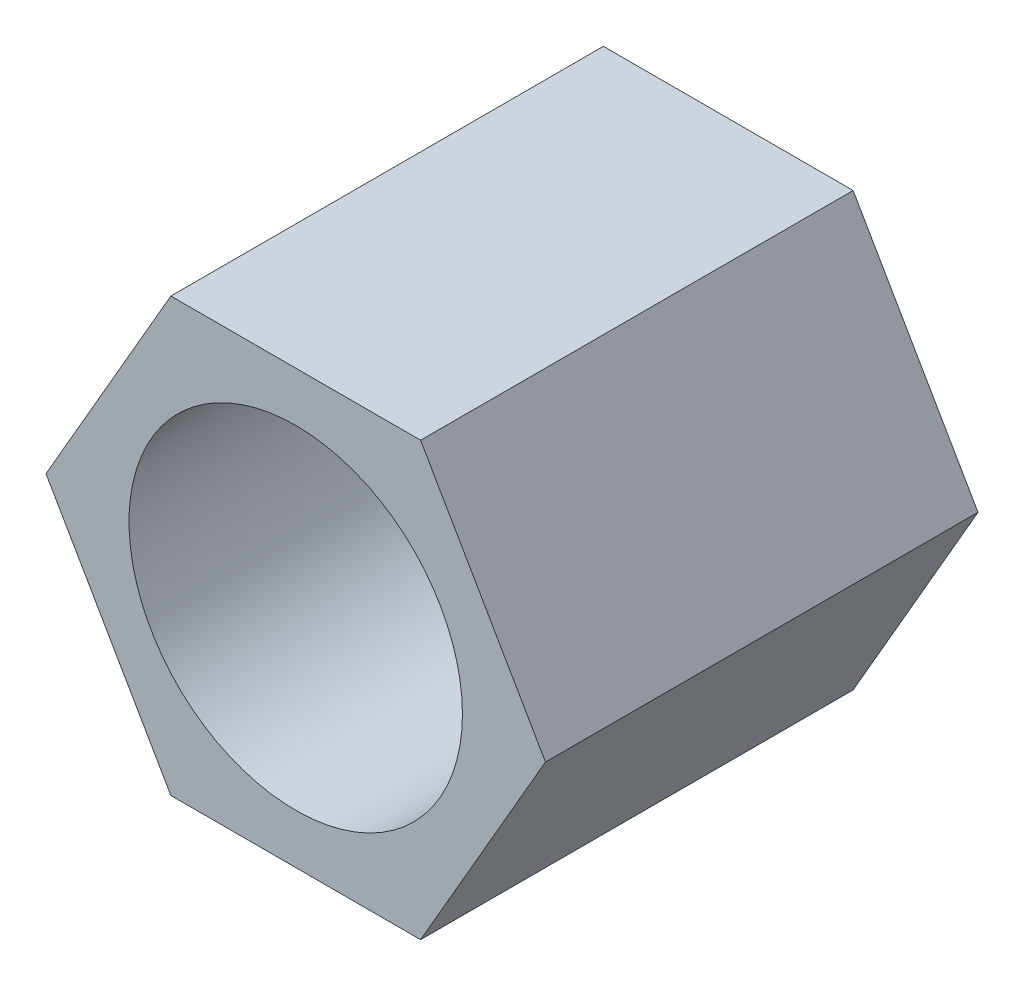
ISO-10303-21;
HEADER;
FILE_DESCRIPTION(('STEP AP214'),'2;1');
FILE_NAME('part.step','',(''),(''),'','','');
FILE_SCHEMA(('AUTOMOTIVE_DESIGN { 1 0 10303 214 1 1 1 1 }'));
ENDSEC;
DATA;
#1=APPLICATION_CONTEXT('core data for automotive mechanical design processes');
#2=APPLICATION_PROTOCOL_DEFINITION('international standard','automotive_design',2000,#1);
#3=PRODUCT_CONTEXT('',#1,'mechanical');
#4=PRODUCT('Part','Part','',(#3));
#5=PRODUCT_RELATED_PRODUCT_CATEGORY('part','',(#4));
#6=PRODUCT_DEFINITION_FORMATION('','',#4);
#7=PRODUCT_DEFINITION_CONTEXT('part definition',#1,'design');
#8=PRODUCT_DEFINITION('design','',#6,#7);
#9=PRODUCT_DEFINITION_SHAPE('','',#8);
#10=(LENGTH_UNIT() NAMED_UNIT(*) SI_UNIT(.MILLI.,.METRE.));
#11=(NAMED_UNIT(*) PLANE_ANGLE_UNIT() SI_UNIT($,.RADIAN.));
#12=(NAMED_UNIT(*) SI_UNIT($,.STERADIAN.) SOLID_ANGLE_UNIT());
#13=UNCERTAINTY_MEASURE_WITH_UNIT(LENGTH_MEASURE(1.E-05),#10,'distance_accuracy_value','');
#14=(GEOMETRIC_REPRESENTATION_CONTEXT(3) GLOBAL_UNCERTAINTY_ASSIGNED_CONTEXT((#13)) GLOBAL_UNIT_ASSIGNED_CONTEXT((#10,
#11,#12)) REPRESENTATION_CONTEXT('',''));
#15=CARTESIAN_POINT('',(0.,0.,0.));
#16=DIRECTION('',(0.,0.,1.));
#17=DIRECTION('',(1.,0.,0.));
#18=AXIS2_PLACEMENT_3D('',#15,#16,#17);
#19=CARTESIAN_POINT('',(0.,0.,-9.525));
#20=DIRECTION('',(0.,0.,1.));
#21=DIRECTION('',(1.,0.,0.));
#22=AXIS2_PLACEMENT_3D('',#19,#20,#21);
#23=PLANE('',#22);
#24=DIRECTION('',(-1.,0.,0.));
#25=VECTOR('',#24,1.);
#26=CARTESIAN_POINT('',(-5.49926131403109,-9.52500000000004,-9.525));
#27=LINE('',#26,#25);
#28=CARTESIAN_POINT('',(5.49926131403127,-9.52499999999995,-9.525));
#29=VERTEX_POINT('',#28);
#30=CARTESIAN_POINT('',(-5.49926131403109,-9.52500000000004,-9.525));
#31=VERTEX_POINT('',#30);
#32=EDGE_CURVE('E113',#29,#31,#27,.T.);
#33=ORIENTED_EDGE('',*,*,#32,.T.);
#34=DIRECTION('',(-0.500000000000007,0.866025403784435,0.));
#35=VECTOR('',#34,1.);
#36=CARTESIAN_POINT('',(-10.9985226280624,0.,-9.525));
#37=LINE('',#36,#35);
#38=CARTESIAN_POINT('',(-10.9985226280624,0.,-9.525));
#39=VERTEX_POINT('',#38);
#40=EDGE_CURVE('E118',#31,#39,#37,.T.);
#41=ORIENTED_EDGE('',*,*,#40,.T.);
#42=DIRECTION('',(0.499999999999995,0.866025403784442,0.));
#43=VECTOR('',#42,1.);
#44=CARTESIAN_POINT('',(-5.49926131403122,9.52499999999996,-9.525));
#45=LINE('',#44,#43);
#46=CARTESIAN_POINT('',(-5.49926131403122,9.52499999999997,-9.525));
#47=VERTEX_POINT('',#46);
#48=EDGE_CURVE('E124',#39,#47,#45,.T.);
#49=ORIENTED_EDGE('',*,*,#48,.T.);
#50=DIRECTION('',(1.,0.,0.));
#51=VECTOR('',#50,1.);
#52=CARTESIAN_POINT('',(5.49926131403116,9.525,-9.525));
#53=LINE('',#52,#51);
#54=CARTESIAN_POINT('',(5.49926131403116,9.525,-9.525));
#55=VERTEX_POINT('',#54);
#56=EDGE_CURVE('E90',#47,#55,#53,.T.);
#57=ORIENTED_EDGE('',*,*,#56,.T.);
#58=DIRECTION('',(0.500000000000001,-0.866025403784438,0.));
#59=VECTOR('',#58,1.);
#60=CARTESIAN_POINT('',(10.9985226280624,0.,-9.525));
#61=LINE('',#60,#59);
#62=CARTESIAN_POINT('',(10.9985226280624,0.,-9.525));
#63=VERTEX_POINT('',#62);
#64=EDGE_CURVE('E68',#55,#63,#61,.T.);
#65=ORIENTED_EDGE('',*,*,#64,.T.);
#66=DIRECTION('',(-0.499999999999995,-0.866025403784442,0.));
#67=VECTOR('',#66,1.);
#68=CARTESIAN_POINT('',(5.49926131403129,-9.52499999999992,-9.525));
#69=LINE('',#68,#67);
#70=EDGE_CURVE('E74',#63,#29,#69,.T.);
#71=ORIENTED_EDGE('',*,*,#70,.T.);
#72=EDGE_LOOP('',(#33,#41,#49,#57,#65,#71));
#73=FACE_BOUND('',#72,.T.);
#74=CARTESIAN_POINT('',(0.,0.,-9.525));
#75=DIRECTION('',(0.,0.,-1.));
#76=DIRECTION('',(-1.,0.,0.));
#77=AXIS2_PLACEMENT_3D('',#74,#75,#76);
#78=CIRCLE('',#77,3.429);
#79=CARTESIAN_POINT('',(-3.429,0.,-9.525));
#80=VERTEX_POINT('',#79);
#81=EDGE_CURVE('E20',#80,#80,#78,.F.);
#82=ORIENTED_EDGE('',*,*,#81,.T.);
#83=EDGE_LOOP('',(#82));
#84=FACE_BOUND('',#83,.T.);
#85=ADVANCED_FACE('F17',(#73,#84),#23,.F.);
#86=CARTESIAN_POINT('',(5.49926131403129,-9.52499999999992,9.525));
#87=DIRECTION('',(-0.866025403784442,0.499999999999995,0.));
#88=DIRECTION('',(-0.499999999999995,-0.866025403784442,0.));
#89=AXIS2_PLACEMENT_3D('',#86,#87,#88);
#90=PLANE('',#89);
#91=DIRECTION('',(0.,0.,1.));
#92=VECTOR('',#91,1.);
#93=CARTESIAN_POINT('',(10.9985226280624,0.,9.525));
#94=LINE('',#93,#92);
#95=CARTESIAN_POINT('',(10.9985226280624,0.,9.525));
#96=VERTEX_POINT('',#95);
#97=EDGE_CURVE('E77',#63,#96,#94,.T.);
#98=ORIENTED_EDGE('',*,*,#97,.T.);
#99=DIRECTION('',(0.499999999999995,0.866025403784441,0.));
#100=VECTOR('',#99,1.);
#101=CARTESIAN_POINT('',(5.49926131403129,-9.52499999999992,9.525));
#102=LINE('',#101,#100);
#103=CARTESIAN_POINT('',(5.49926131403127,-9.52499999999995,9.525));
#104=VERTEX_POINT('',#103);
#105=EDGE_CURVE('E111',#104,#96,#102,.T.);
#106=ORIENTED_EDGE('',*,*,#105,.F.);
#107=DIRECTION('',(0.,0.,1.));
#108=VECTOR('',#107,1.);
#109=CARTESIAN_POINT('',(5.49926131403129,-9.52499999999992,9.525));
#110=LINE('',#109,#108);
#111=EDGE_CURVE('E79',#104,#29,#110,.F.);
#112=ORIENTED_EDGE('',*,*,#111,.T.);
#113=ORIENTED_EDGE('',*,*,#70,.F.);
#114=EDGE_LOOP('',(#98,#106,#112,#113));
#115=FACE_BOUND('',#114,.T.);
#116=ADVANCED_FACE('F75',(#115),#90,.F.);
#117=CARTESIAN_POINT('',(10.9985226280624,0.,9.525));
#118=DIRECTION('',(-0.866025403784438,-0.500000000000001,0.));
#119=DIRECTION('',(0.500000000000001,-0.866025403784438,0.));
#120=AXIS2_PLACEMENT_3D('',#117,#118,#119);
#121=PLANE('',#120);
#122=DIRECTION('',(0.,0.,1.));
#123=VECTOR('',#122,1.);
#124=CARTESIAN_POINT('',(5.49926131403116,9.525,9.525));
#125=LINE('',#124,#123);
#126=CARTESIAN_POINT('',(5.49926131403116,9.525,9.525));
#127=VERTEX_POINT('',#126);
#128=EDGE_CURVE('E91',#55,#127,#125,.T.);
#129=ORIENTED_EDGE('',*,*,#128,.T.);
#130=DIRECTION('',(-0.500000000000001,0.866025403784438,0.));
#131=VECTOR('',#130,1.);
#132=CARTESIAN_POINT('',(10.9985226280624,0.,9.525));
#133=LINE('',#132,#131);
#134=EDGE_CURVE('E85',#96,#127,#133,.T.);
#135=ORIENTED_EDGE('',*,*,#134,.F.);
#136=ORIENTED_EDGE('',*,*,#97,.F.);
#137=ORIENTED_EDGE('',*,*,#64,.F.);
#138=EDGE_LOOP('',(#129,#135,#136,#137));
#139=FACE_BOUND('',#138,.T.);
#140=ADVANCED_FACE('F84',(#139),#121,.F.);
#141=CARTESIAN_POINT('',(5.49926131403116,9.525,9.525));
#142=DIRECTION('',(0.,-1.,0.));
#143=DIRECTION('',(1.,0.,0.));
#144=AXIS2_PLACEMENT_3D('',#141,#142,#143);
#145=PLANE('',#144);
#146=DIRECTION('',(0.,0.,1.));
#147=VECTOR('',#146,1.);
#148=CARTESIAN_POINT('',(-5.49926131403122,9.52499999999996,9.525));
#149=LINE('',#148,#147);
#150=CARTESIAN_POINT('',(-5.49926131403122,9.52499999999997,9.525));
#151=VERTEX_POINT('',#150);
#152=EDGE_CURVE('E126',#47,#151,#149,.T.);
#153=ORIENTED_EDGE('',*,*,#152,.T.);
#154=DIRECTION('',(1.,0.,0.));
#155=VECTOR('',#154,1.);
#156=CARTESIAN_POINT('',(0.,9.525,9.525));
#157=LINE('',#156,#155);
#158=EDGE_CURVE('E108',#127,#151,#157,.F.);
#159=ORIENTED_EDGE('',*,*,#158,.F.);
#160=ORIENTED_EDGE('',*,*,#128,.F.);
#161=ORIENTED_EDGE('',*,*,#56,.F.);
#162=EDGE_LOOP('',(#153,#159,#160,#161));
#163=FACE_BOUND('',#162,.T.);
#164=ADVANCED_FACE('F132',(#163),#145,.F.);
#165=CARTESIAN_POINT('',(-5.49926131403122,9.52499999999996,9.525));
#166=DIRECTION('',(0.866025403784442,-0.499999999999995,0.));
#167=DIRECTION('',(0.499999999999995,0.866025403784442,0.));
#168=AXIS2_PLACEMENT_3D('',#165,#166,#167);
#169=PLANE('',#168);
#170=DIRECTION('',(0.,0.,1.));
#171=VECTOR('',#170,1.);
#172=CARTESIAN_POINT('',(-10.9985226280624,0.,9.525));
#173=LINE('',#172,#171);
#174=CARTESIAN_POINT('',(-10.9985226280624,0.,9.525));
#175=VERTEX_POINT('',#174);
#176=EDGE_CURVE('E121',#39,#175,#173,.T.);
#177=ORIENTED_EDGE('',*,*,#176,.T.);
#178=DIRECTION('',(-0.499999999999995,-0.866025403784442,0.));
#179=VECTOR('',#178,1.);
#180=CARTESIAN_POINT('',(-5.49926131403122,9.52499999999996,9.525));
#181=LINE('',#180,#179);
#182=EDGE_CURVE('E104',#151,#175,#181,.T.);
#183=ORIENTED_EDGE('',*,*,#182,.F.);
#184=ORIENTED_EDGE('',*,*,#152,.F.);
#185=ORIENTED_EDGE('',*,*,#48,.F.);
#186=EDGE_LOOP('',(#177,#183,#184,#185));
#187=FACE_BOUND('',#186,.T.);
#188=ADVANCED_FACE('F134',(#187),#169,.F.);
#189=CARTESIAN_POINT('',(-10.9985226280624,0.,9.525));
#190=DIRECTION('',(0.866025403784435,0.500000000000007,0.));
#191=DIRECTION('',(-0.500000000000007,0.866025403784435,0.));
#192=AXIS2_PLACEMENT_3D('',#189,#190,#191);
#193=PLANE('',#192);
#194=DIRECTION('',(0.,0.,1.));
#195=VECTOR('',#194,1.);
#196=CARTESIAN_POINT('',(-5.49926131403109,-9.52500000000004,9.525));
#197=LINE('',#196,#195);
#198=CARTESIAN_POINT('',(-5.49926131403109,-9.52500000000004,9.525));
#199=VERTEX_POINT('',#198);
#200=EDGE_CURVE('E116',#31,#199,#197,.T.);
#201=ORIENTED_EDGE('',*,*,#200,.T.);
#202=DIRECTION('',(0.500000000000007,-0.866025403784435,0.));
#203=VECTOR('',#202,1.);
#204=CARTESIAN_POINT('',(-10.9985226280624,0.,9.525));
#205=LINE('',#204,#203);
#206=EDGE_CURVE('E35',#175,#199,#205,.T.);
#207=ORIENTED_EDGE('',*,*,#206,.F.);
#208=ORIENTED_EDGE('',*,*,#176,.F.);
#209=ORIENTED_EDGE('',*,*,#40,.F.);
#210=EDGE_LOOP('',(#201,#207,#208,#209));
#211=FACE_BOUND('',#210,.T.);
#212=ADVANCED_FACE('F162',(#211),#193,.F.);
#213=CARTESIAN_POINT('',(-5.49926131403109,-9.52500000000004,9.525));
#214=DIRECTION('',(0.,1.,0.));
#215=DIRECTION('',(-1.,0.,0.));
#216=AXIS2_PLACEMENT_3D('',#213,#214,#215);
#217=PLANE('',#216);
#218=ORIENTED_EDGE('',*,*,#111,.F.);
#219=DIRECTION('',(1.,0.,0.));
#220=VECTOR('',#219,1.);
#221=CARTESIAN_POINT('',(0.,-9.52500000000004,9.525));
#222=LINE('',#221,#220);
#223=EDGE_CURVE('E99',#199,#104,#222,.T.);
#224=ORIENTED_EDGE('',*,*,#223,.F.);
#225=ORIENTED_EDGE('',*,*,#200,.F.);
#226=ORIENTED_EDGE('',*,*,#32,.F.);
#227=EDGE_LOOP('',(#218,#224,#225,#226));
#228=FACE_BOUND('',#227,.T.);
#229=ADVANCED_FACE('F158',(#228),#217,.F.);
#230=CARTESIAN_POINT('',(0.,0.,-6.35));
#231=DIRECTION('',(0.,0.,-1.));
#232=DIRECTION('',(-1.,0.,0.));
#233=AXIS2_PLACEMENT_3D('',#230,#231,#232);
#234=CYLINDRICAL_SURFACE('',#233,3.429);
#235=ORIENTED_EDGE('',*,*,#81,.F.);
#236=EDGE_LOOP('',(#235));
#237=FACE_BOUND('',#236,.T.);
#238=CARTESIAN_POINT('',(0.,0.,-6.35));
#239=DIRECTION('',(0.,0.,-1.));
#240=DIRECTION('',(-1.,0.,0.));
#241=AXIS2_PLACEMENT_3D('',#238,#239,#240);
#242=CIRCLE('',#241,3.429);
#243=CARTESIAN_POINT('',(-3.429,0.,-6.35));
#244=VERTEX_POINT('',#243);
#245=EDGE_CURVE('E97',#244,#244,#242,.T.);
#246=ORIENTED_EDGE('',*,*,#245,.F.);
#247=EDGE_LOOP('',(#246));
#248=FACE_BOUND('',#247,.T.);
#249=ADVANCED_FACE('F140',(#237,#248),#234,.F.);
#250=CARTESIAN_POINT('',(0.,0.,9.525));
#251=DIRECTION('',(0.,0.,1.));
#252=DIRECTION('',(1.,0.,0.));
#253=AXIS2_PLACEMENT_3D('',#250,#251,#252);
#254=PLANE('',#253);
#255=ORIENTED_EDGE('',*,*,#206,.T.);
#256=ORIENTED_EDGE('',*,*,#223,.T.);
#257=ORIENTED_EDGE('',*,*,#105,.T.);
#258=ORIENTED_EDGE('',*,*,#134,.T.);
#259=ORIENTED_EDGE('',*,*,#158,.T.);
#260=ORIENTED_EDGE('',*,*,#182,.T.);
#261=EDGE_LOOP('',(#255,#256,#257,#258,#259,#260));
#262=FACE_BOUND('',#261,.T.);
#263=CARTESIAN_POINT('',(0.,0.,9.525));
#264=DIRECTION('',(0.,0.,1.));
#265=DIRECTION('',(1.,0.,0.));
#266=AXIS2_PLACEMENT_3D('',#263,#264,#265);
#267=CIRCLE('',#266,7.34187);
#268=CARTESIAN_POINT('',(7.34187,0.,9.525));
#269=VERTEX_POINT('',#268);
#270=EDGE_CURVE('E26',#269,#269,#267,.F.);
#271=ORIENTED_EDGE('',*,*,#270,.T.);
#272=EDGE_LOOP('',(#271));
#273=FACE_BOUND('',#272,.T.);
#274=ADVANCED_FACE('F136',(#262,#273),#254,.T.);
#275=CARTESIAN_POINT('',(0.,0.,-6.35));
#276=DIRECTION('',(0.,0.,1.));
#277=DIRECTION('',(1.,0.,0.));
#278=AXIS2_PLACEMENT_3D('',#275,#276,#277);
#279=PLANE('',#278);
#280=CARTESIAN_POINT('',(0.,0.,-6.35));
#281=DIRECTION('',(0.,0.,1.));
#282=DIRECTION('',(1.,0.,0.));
#283=AXIS2_PLACEMENT_3D('',#280,#281,#282);
#284=CIRCLE('',#283,7.34187);
#285=CARTESIAN_POINT('',(7.34187,0.,-6.35));
#286=VERTEX_POINT('',#285);
#287=EDGE_CURVE('E11',#286,#286,#284,.T.);
#288=ORIENTED_EDGE('',*,*,#287,.T.);
#289=EDGE_LOOP('',(#288));
#290=FACE_BOUND('',#289,.T.);
#291=ORIENTED_EDGE('',*,*,#245,.T.);
#292=EDGE_LOOP('',(#291));
#293=FACE_BOUND('',#292,.T.);
#294=ADVANCED_FACE('F139',(#290,#293),#279,.T.);
#295=CARTESIAN_POINT('',(0.,0.,-6.35));
#296=DIRECTION('',(0.,0.,1.));
#297=DIRECTION('',(1.,0.,0.));
#298=AXIS2_PLACEMENT_3D('',#295,#296,#297);
#299=CYLINDRICAL_SURFACE('',#298,7.34187);
#300=ORIENTED_EDGE('',*,*,#270,.F.);
#301=EDGE_LOOP('',(#300));
#302=FACE_BOUND('',#301,.T.);
#303=ORIENTED_EDGE('',*,*,#287,.F.);
#304=EDGE_LOOP('',(#303));
#305=FACE_BOUND('',#304,.T.);
#306=ADVANCED_FACE('F144',(#302,#305),#299,.F.);
#307=CLOSED_SHELL('',(#85,#116,#140,#164,#188,#212,#229,#249,#274,#294,#306));
#308=MANIFOLD_SOLID_BREP('B1',#307);
#309=ADVANCED_BREP_SHAPE_REPRESENTATION('',(#18,#308),#14);
#310=SHAPE_DEFINITION_REPRESENTATION(#9,#309);
ENDSEC;
END-ISO-10303-21;
